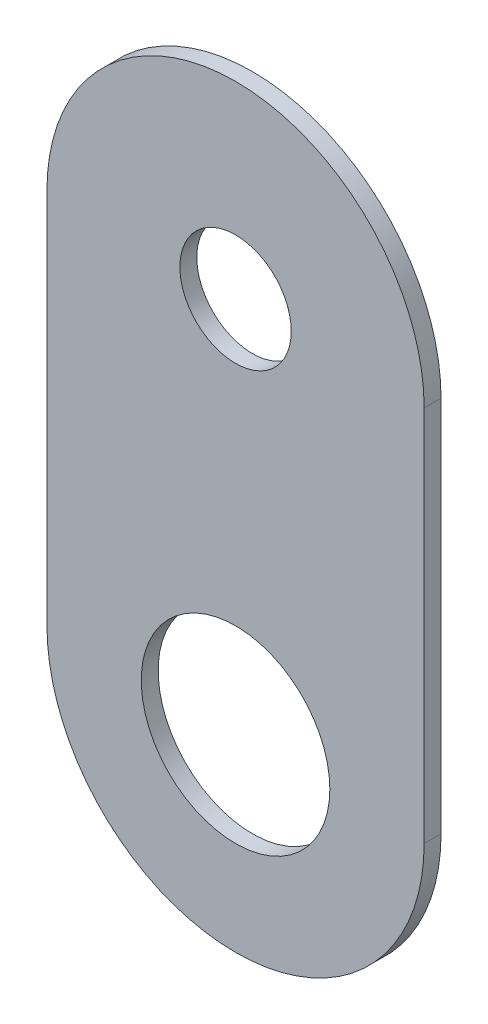
ISO-10303-21;
HEADER;
FILE_DESCRIPTION(('STEP AP214'),'2;1');
FILE_NAME('part.step','',(''),(''),'','','');
FILE_SCHEMA(('AUTOMOTIVE_DESIGN { 1 0 10303 214 1 1 1 1 }'));
ENDSEC;
DATA;
#1=APPLICATION_CONTEXT('core data for automotive mechanical design processes');
#2=APPLICATION_PROTOCOL_DEFINITION('international standard','automotive_design',2000,#1);
#3=PRODUCT_CONTEXT('',#1,'mechanical');
#4=PRODUCT('Part','Part','',(#3));
#5=PRODUCT_RELATED_PRODUCT_CATEGORY('part','',(#4));
#6=PRODUCT_DEFINITION_FORMATION('','',#4);
#7=PRODUCT_DEFINITION_CONTEXT('part definition',#1,'design');
#8=PRODUCT_DEFINITION('design','',#6,#7);
#9=PRODUCT_DEFINITION_SHAPE('','',#8);
#10=(LENGTH_UNIT() NAMED_UNIT(*) SI_UNIT(.MILLI.,.METRE.));
#11=(NAMED_UNIT(*) PLANE_ANGLE_UNIT() SI_UNIT($,.RADIAN.));
#12=(NAMED_UNIT(*) SI_UNIT($,.STERADIAN.) SOLID_ANGLE_UNIT());
#13=UNCERTAINTY_MEASURE_WITH_UNIT(LENGTH_MEASURE(1.E-05),#10,'distance_accuracy_value','');
#14=(GEOMETRIC_REPRESENTATION_CONTEXT(3) GLOBAL_UNCERTAINTY_ASSIGNED_CONTEXT((#13)) GLOBAL_UNIT_ASSIGNED_CONTEXT((#10,
#11,#12)) REPRESENTATION_CONTEXT('',''));
#15=CARTESIAN_POINT('',(0.,0.,0.));
#16=DIRECTION('',(0.,0.,1.));
#17=DIRECTION('',(1.,0.,0.));
#18=AXIS2_PLACEMENT_3D('',#15,#16,#17);
#19=CARTESIAN_POINT('',(0.,-50.8,2.27613048203842));
#20=DIRECTION('',(0.,0.,-1.));
#21=DIRECTION('',(-1.,0.,0.));
#22=AXIS2_PLACEMENT_3D('',#19,#20,#21);
#23=CYLINDRICAL_SURFACE('',#22,25.4);
#24=CARTESIAN_POINT('',(0.,-50.8,0.));
#25=DIRECTION('',(0.,0.,1.));
#26=DIRECTION('',(1.,0.,0.));
#27=AXIS2_PLACEMENT_3D('',#24,#25,#26);
#28=CIRCLE('',#27,25.4);
#29=CARTESIAN_POINT('',(-25.4,-50.8,0.));
#30=VERTEX_POINT('',#29);
#31=CARTESIAN_POINT('',(25.4,-50.8,0.));
#32=VERTEX_POINT('',#31);
#33=EDGE_CURVE('E596',#30,#32,#28,.T.);
#34=ORIENTED_EDGE('',*,*,#33,.T.);
#35=DIRECTION('',(0.,0.,-1.));
#36=VECTOR('',#35,1.);
#37=CARTESIAN_POINT('',(25.4,-50.8,2.27613048203842));
#38=LINE('',#37,#36);
#39=CARTESIAN_POINT('',(25.4,-50.8,2.27613048203842));
#40=VERTEX_POINT('',#39);
#41=EDGE_CURVE('E14',#40,#32,#38,.T.);
#42=ORIENTED_EDGE('',*,*,#41,.F.);
#43=CARTESIAN_POINT('',(0.,-50.8,2.27613048203842));
#44=DIRECTION('',(0.,0.,1.));
#45=DIRECTION('',(1.,0.,0.));
#46=AXIS2_PLACEMENT_3D('',#43,#44,#45);
#47=CIRCLE('',#46,25.4);
#48=CARTESIAN_POINT('',(-25.4,-50.8,2.27613048203842));
#49=VERTEX_POINT('',#48);
#50=EDGE_CURVE('E560',#49,#40,#47,.T.);
#51=ORIENTED_EDGE('',*,*,#50,.F.);
#52=DIRECTION('',(0.,0.,-1.));
#53=VECTOR('',#52,1.);
#54=CARTESIAN_POINT('',(-25.4,-50.8,2.27613048203842));
#55=LINE('',#54,#53);
#56=EDGE_CURVE('E594',#49,#30,#55,.T.);
#57=ORIENTED_EDGE('',*,*,#56,.T.);
#58=EDGE_LOOP('',(#34,#42,#51,#57));
#59=FACE_BOUND('',#58,.T.);
#60=ADVANCED_FACE('F513',(#59),#23,.T.);
#61=CARTESIAN_POINT('',(25.4,0.,2.27613048203842));
#62=DIRECTION('',(1.,0.,0.));
#63=DIRECTION('',(0.,1.,0.));
#64=AXIS2_PLACEMENT_3D('',#61,#62,#63);
#65=PLANE('',#64);
#66=DIRECTION('',(0.,-1.,0.));
#67=VECTOR('',#66,1.);
#68=CARTESIAN_POINT('',(25.4,0.,0.));
#69=LINE('',#68,#67);
#70=CARTESIAN_POINT('',(25.4,0.,0.));
#71=VERTEX_POINT('',#70);
#72=EDGE_CURVE('E566',#71,#32,#69,.T.);
#73=ORIENTED_EDGE('',*,*,#72,.F.);
#74=DIRECTION('',(0.,0.,-1.));
#75=VECTOR('',#74,1.);
#76=CARTESIAN_POINT('',(25.4,0.,2.27613048203842));
#77=LINE('',#76,#75);
#78=CARTESIAN_POINT('',(25.4,0.,2.27613048203842));
#79=VERTEX_POINT('',#78);
#80=EDGE_CURVE('E525',#79,#71,#77,.T.);
#81=ORIENTED_EDGE('',*,*,#80,.F.);
#82=DIRECTION('',(0.,-1.,0.));
#83=VECTOR('',#82,1.);
#84=CARTESIAN_POINT('',(25.4,0.,2.27613048203842));
#85=LINE('',#84,#83);
#86=EDGE_CURVE('E567',#79,#40,#85,.T.);
#87=ORIENTED_EDGE('',*,*,#86,.T.);
#88=ORIENTED_EDGE('',*,*,#41,.T.);
#89=EDGE_LOOP('',(#73,#81,#87,#88));
#90=FACE_BOUND('',#89,.T.);
#91=ADVANCED_FACE('F561',(#90),#65,.T.);
#92=CARTESIAN_POINT('',(0.,0.,2.27613048203842));
#93=DIRECTION('',(0.,0.,-1.));
#94=DIRECTION('',(-1.,0.,0.));
#95=AXIS2_PLACEMENT_3D('',#92,#93,#94);
#96=CYLINDRICAL_SURFACE('',#95,25.4);
#97=CARTESIAN_POINT('',(0.,0.,0.));
#98=DIRECTION('',(0.,0.,1.));
#99=DIRECTION('',(1.,0.,0.));
#100=AXIS2_PLACEMENT_3D('',#97,#98,#99);
#101=CIRCLE('',#100,25.4);
#102=CARTESIAN_POINT('',(-25.4,0.,0.));
#103=VERTEX_POINT('',#102);
#104=EDGE_CURVE('E550',#71,#103,#101,.T.);
#105=ORIENTED_EDGE('',*,*,#104,.T.);
#106=DIRECTION('',(0.,0.,-1.));
#107=VECTOR('',#106,1.);
#108=CARTESIAN_POINT('',(-25.4,0.,2.27613048203842));
#109=LINE('',#108,#107);
#110=CARTESIAN_POINT('',(-25.4,0.,2.27613048203842));
#111=VERTEX_POINT('',#110);
#112=EDGE_CURVE('E568',#111,#103,#109,.T.);
#113=ORIENTED_EDGE('',*,*,#112,.F.);
#114=CARTESIAN_POINT('',(0.,0.,2.27613048203842));
#115=DIRECTION('',(0.,0.,1.));
#116=DIRECTION('',(1.,0.,0.));
#117=AXIS2_PLACEMENT_3D('',#114,#115,#116);
#118=CIRCLE('',#117,25.4);
#119=EDGE_CURVE('E574',#79,#111,#118,.T.);
#120=ORIENTED_EDGE('',*,*,#119,.F.);
#121=ORIENTED_EDGE('',*,*,#80,.T.);
#122=EDGE_LOOP('',(#105,#113,#120,#121));
#123=FACE_BOUND('',#122,.T.);
#124=ADVANCED_FACE('F571',(#123),#96,.T.);
#125=CARTESIAN_POINT('',(0.,-50.8,2.27613048203842));
#126=DIRECTION('',(0.,0.,-1.));
#127=DIRECTION('',(-1.,0.,0.));
#128=AXIS2_PLACEMENT_3D('',#125,#126,#127);
#129=CYLINDRICAL_SURFACE('',#128,12.7);
#130=CARTESIAN_POINT('',(0.,-50.8,2.27613048203842));
#131=DIRECTION('',(0.,0.,1.));
#132=DIRECTION('',(1.,0.,0.));
#133=AXIS2_PLACEMENT_3D('',#130,#131,#132);
#134=CIRCLE('',#133,12.7);
#135=CARTESIAN_POINT('',(12.7,-50.8,2.27613048203842));
#136=VERTEX_POINT('',#135);
#137=EDGE_CURVE('E590',#136,#136,#134,.T.);
#138=ORIENTED_EDGE('',*,*,#137,.T.);
#139=EDGE_LOOP('',(#138));
#140=FACE_BOUND('',#139,.T.);
#141=CARTESIAN_POINT('',(0.,-50.8,0.));
#142=DIRECTION('',(0.,0.,1.));
#143=DIRECTION('',(1.,0.,0.));
#144=AXIS2_PLACEMENT_3D('',#141,#142,#143);
#145=CIRCLE('',#144,12.7);
#146=CARTESIAN_POINT('',(12.7,-50.8,0.));
#147=VERTEX_POINT('',#146);
#148=EDGE_CURVE('E607',#147,#147,#145,.T.);
#149=ORIENTED_EDGE('',*,*,#148,.F.);
#150=EDGE_LOOP('',(#149));
#151=FACE_BOUND('',#150,.T.);
#152=ADVANCED_FACE('F633',(#140,#151),#129,.F.);
#153=CARTESIAN_POINT('',(-25.4,0.,2.27613048203842));
#154=DIRECTION('',(1.,0.,0.));
#155=DIRECTION('',(0.,1.,0.));
#156=AXIS2_PLACEMENT_3D('',#153,#154,#155);
#157=PLANE('',#156);
#158=DIRECTION('',(0.,-1.,0.));
#159=VECTOR('',#158,1.);
#160=CARTESIAN_POINT('',(-25.4,0.,0.));
#161=LINE('',#160,#159);
#162=EDGE_CURVE('E554',#103,#30,#161,.T.);
#163=ORIENTED_EDGE('',*,*,#162,.T.);
#164=ORIENTED_EDGE('',*,*,#56,.F.);
#165=DIRECTION('',(0.,-1.,0.));
#166=VECTOR('',#165,1.);
#167=CARTESIAN_POINT('',(-25.4,0.,2.27613048203842));
#168=LINE('',#167,#166);
#169=EDGE_CURVE('E535',#111,#49,#168,.T.);
#170=ORIENTED_EDGE('',*,*,#169,.F.);
#171=ORIENTED_EDGE('',*,*,#112,.T.);
#172=EDGE_LOOP('',(#163,#164,#170,#171));
#173=FACE_BOUND('',#172,.T.);
#174=ADVANCED_FACE('F617',(#173),#157,.F.);
#175=CARTESIAN_POINT('',(0.,0.,2.27613048203842));
#176=DIRECTION('',(0.,0.,-1.));
#177=DIRECTION('',(-1.,0.,0.));
#178=AXIS2_PLACEMENT_3D('',#175,#176,#177);
#179=CYLINDRICAL_SURFACE('',#178,7.49814945212492);
#180=CARTESIAN_POINT('',(0.,0.,2.27613048203842));
#181=DIRECTION('',(0.,0.,1.));
#182=DIRECTION('',(1.,0.,0.));
#183=AXIS2_PLACEMENT_3D('',#180,#181,#182);
#184=CIRCLE('',#183,7.49814945212492);
#185=CARTESIAN_POINT('',(7.49814945212492,0.,2.27613048203842));
#186=VERTEX_POINT('',#185);
#187=EDGE_CURVE('E591',#186,#186,#184,.T.);
#188=ORIENTED_EDGE('',*,*,#187,.T.);
#189=EDGE_LOOP('',(#188));
#190=FACE_BOUND('',#189,.T.);
#191=CARTESIAN_POINT('',(0.,0.,0.));
#192=DIRECTION('',(0.,0.,1.));
#193=DIRECTION('',(1.,0.,0.));
#194=AXIS2_PLACEMENT_3D('',#191,#192,#193);
#195=CIRCLE('',#194,7.49814945212492);
#196=CARTESIAN_POINT('',(7.49814945212492,0.,0.));
#197=VERTEX_POINT('',#196);
#198=EDGE_CURVE('E582',#197,#197,#195,.T.);
#199=ORIENTED_EDGE('',*,*,#198,.F.);
#200=EDGE_LOOP('',(#199));
#201=FACE_BOUND('',#200,.T.);
#202=ADVANCED_FACE('F638',(#190,#201),#179,.F.);
#203=CARTESIAN_POINT('',(0.,0.,2.27613048203842));
#204=DIRECTION('',(0.,0.,1.));
#205=DIRECTION('',(1.,0.,0.));
#206=AXIS2_PLACEMENT_3D('',#203,#204,#205);
#207=PLANE('',#206);
#208=ORIENTED_EDGE('',*,*,#50,.T.);
#209=ORIENTED_EDGE('',*,*,#86,.F.);
#210=ORIENTED_EDGE('',*,*,#119,.T.);
#211=ORIENTED_EDGE('',*,*,#169,.T.);
#212=EDGE_LOOP('',(#208,#209,#210,#211));
#213=FACE_BOUND('',#212,.T.);
#214=ORIENTED_EDGE('',*,*,#137,.F.);
#215=EDGE_LOOP('',(#214));
#216=FACE_BOUND('',#215,.T.);
#217=ORIENTED_EDGE('',*,*,#187,.F.);
#218=EDGE_LOOP('',(#217));
#219=FACE_BOUND('',#218,.T.);
#220=ADVANCED_FACE('F572',(#213,#216,#219),#207,.T.);
#221=CARTESIAN_POINT('',(0.,0.,0.));
#222=DIRECTION('',(0.,0.,1.));
#223=DIRECTION('',(1.,0.,0.));
#224=AXIS2_PLACEMENT_3D('',#221,#222,#223);
#225=PLANE('',#224);
#226=ORIENTED_EDGE('',*,*,#33,.F.);
#227=ORIENTED_EDGE('',*,*,#162,.F.);
#228=ORIENTED_EDGE('',*,*,#104,.F.);
#229=ORIENTED_EDGE('',*,*,#72,.T.);
#230=EDGE_LOOP('',(#226,#227,#228,#229));
#231=FACE_BOUND('',#230,.T.);
#232=ORIENTED_EDGE('',*,*,#148,.T.);
#233=EDGE_LOOP('',(#232));
#234=FACE_BOUND('',#233,.T.);
#235=ORIENTED_EDGE('',*,*,#198,.T.);
#236=EDGE_LOOP('',(#235));
#237=FACE_BOUND('',#236,.T.);
#238=ADVANCED_FACE('F622',(#231,#234,#237),#225,.F.);
#239=CLOSED_SHELL('',(#60,#91,#124,#152,#174,#202,#220,#238));
#240=MANIFOLD_SOLID_BREP('B2',#239);
#241=ADVANCED_BREP_SHAPE_REPRESENTATION('',(#18,#240),#14);
#242=SHAPE_DEFINITION_REPRESENTATION(#9,#241);
ENDSEC;
END-ISO-10303-21;
